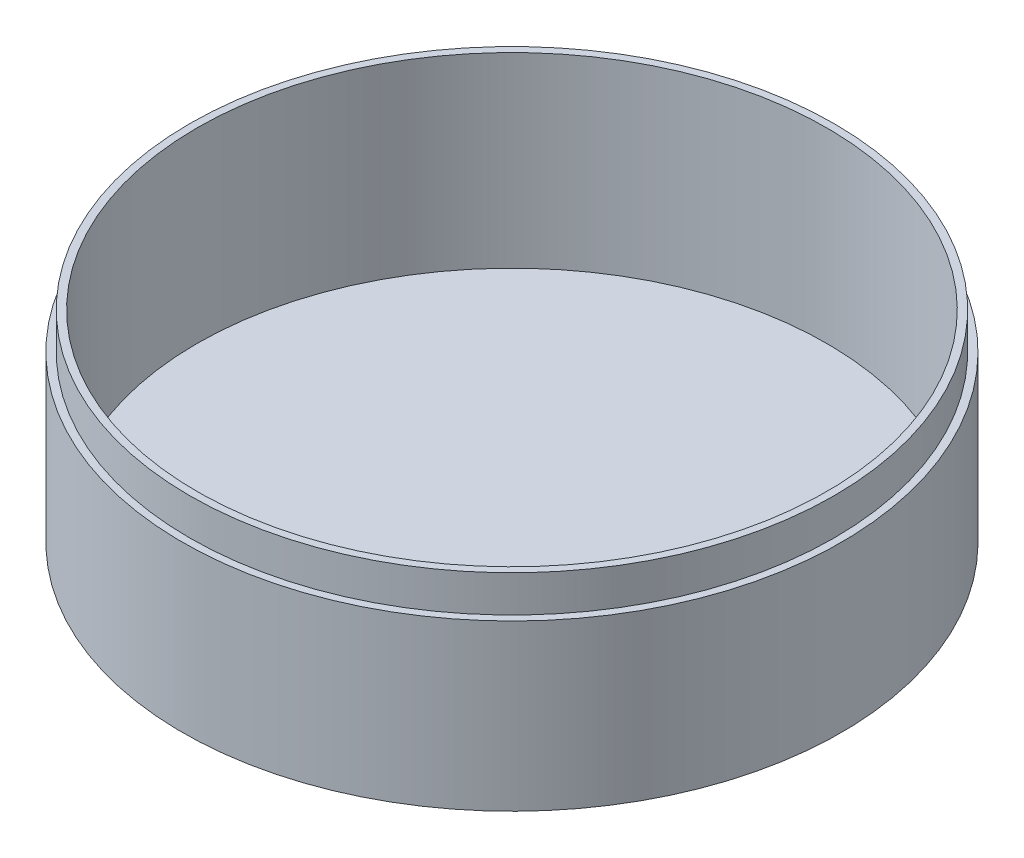
ISO-10303-21;
HEADER;
FILE_DESCRIPTION(('STEP AP214'),'2;1');
FILE_NAME('part.step','',(''),(''),'','','');
FILE_SCHEMA(('AUTOMOTIVE_DESIGN { 1 0 10303 214 1 1 1 1 }'));
ENDSEC;
DATA;
#1=APPLICATION_CONTEXT('core data for automotive mechanical design processes');
#2=APPLICATION_PROTOCOL_DEFINITION('international standard','automotive_design',2000,#1);
#3=PRODUCT_CONTEXT('',#1,'mechanical');
#4=PRODUCT('Part','Part','',(#3));
#5=PRODUCT_RELATED_PRODUCT_CATEGORY('part','',(#4));
#6=PRODUCT_DEFINITION_FORMATION('','',#4);
#7=PRODUCT_DEFINITION_CONTEXT('part definition',#1,'design');
#8=PRODUCT_DEFINITION('design','',#6,#7);
#9=PRODUCT_DEFINITION_SHAPE('','',#8);
#10=(LENGTH_UNIT() NAMED_UNIT(*) SI_UNIT(.MILLI.,.METRE.));
#11=(NAMED_UNIT(*) PLANE_ANGLE_UNIT() SI_UNIT($,.RADIAN.));
#12=(NAMED_UNIT(*) SI_UNIT($,.STERADIAN.) SOLID_ANGLE_UNIT());
#13=UNCERTAINTY_MEASURE_WITH_UNIT(LENGTH_MEASURE(1.E-05),#10,'distance_accuracy_value','');
#14=(GEOMETRIC_REPRESENTATION_CONTEXT(3) GLOBAL_UNCERTAINTY_ASSIGNED_CONTEXT((#13)) GLOBAL_UNIT_ASSIGNED_CONTEXT((#10,
#11,#12)) REPRESENTATION_CONTEXT('',''));
#15=CARTESIAN_POINT('',(0.,0.,0.));
#16=DIRECTION('',(0.,0.,1.));
#17=DIRECTION('',(1.,0.,0.));
#18=AXIS2_PLACEMENT_3D('',#15,#16,#17);
#19=CARTESIAN_POINT('',(0.,0.,0.));
#20=DIRECTION('',(0.,1.,0.));
#21=DIRECTION('',(-1.,0.,0.));
#22=AXIS2_PLACEMENT_3D('',#19,#20,#21);
#23=PLANE('',#22);
#24=CARTESIAN_POINT('',(0.,0.,0.));
#25=DIRECTION('',(0.,1.,0.));
#26=DIRECTION('',(-1.,0.,0.));
#27=AXIS2_PLACEMENT_3D('',#24,#25,#26);
#28=CIRCLE('',#27,114.3);
#29=CARTESIAN_POINT('',(-114.3,0.,0.));
#30=VERTEX_POINT('',#29);
#31=EDGE_CURVE('E10',#30,#30,#28,.T.);
#32=ORIENTED_EDGE('',*,*,#31,.F.);
#33=EDGE_LOOP('',(#32));
#34=FACE_BOUND('',#33,.T.);
#35=ADVANCED_FACE('F35',(#34),#23,.F.);
#36=CARTESIAN_POINT('',(0.,5.08,0.));
#37=DIRECTION('',(0.,1.,0.));
#38=DIRECTION('',(-1.,0.,0.));
#39=AXIS2_PLACEMENT_3D('',#36,#37,#38);
#40=CYLINDRICAL_SURFACE('',#39,114.3);
#41=CARTESIAN_POINT('',(0.,57.15,0.));
#42=DIRECTION('',(0.,1.,0.));
#43=DIRECTION('',(-1.,0.,0.));
#44=AXIS2_PLACEMENT_3D('',#41,#42,#43);
#45=CIRCLE('',#44,114.3);
#46=CARTESIAN_POINT('',(-114.3,57.15,0.));
#47=VERTEX_POINT('',#46);
#48=EDGE_CURVE('E41',#47,#47,#45,.T.);
#49=ORIENTED_EDGE('',*,*,#48,.F.);
#50=EDGE_LOOP('',(#49));
#51=FACE_BOUND('',#50,.T.);
#52=ORIENTED_EDGE('',*,*,#31,.T.);
#53=EDGE_LOOP('',(#52));
#54=FACE_BOUND('',#53,.T.);
#55=ADVANCED_FACE('F83',(#51,#54),#40,.T.);
#56=CARTESIAN_POINT('',(114.3,57.15,0.));
#57=DIRECTION('',(0.,-1.,0.));
#58=DIRECTION('',(1.,0.,0.));
#59=AXIS2_PLACEMENT_3D('',#56,#57,#58);
#60=PLANE('',#59);
#61=CARTESIAN_POINT('',(0.,57.15,0.));
#62=DIRECTION('',(0.,1.,0.));
#63=DIRECTION('',(-1.,0.,0.));
#64=AXIS2_PLACEMENT_3D('',#61,#62,#63);
#65=CIRCLE('',#64,111.76);
#66=CARTESIAN_POINT('',(-111.76,57.15,0.));
#67=VERTEX_POINT('',#66);
#68=EDGE_CURVE('E45',#67,#67,#65,.T.);
#69=ORIENTED_EDGE('',*,*,#68,.F.);
#70=EDGE_LOOP('',(#69));
#71=FACE_BOUND('',#70,.T.);
#72=ORIENTED_EDGE('',*,*,#48,.T.);
#73=EDGE_LOOP('',(#72));
#74=FACE_BOUND('',#73,.T.);
#75=ADVANCED_FACE('F78',(#71,#74),#60,.F.);
#76=CARTESIAN_POINT('',(0.,5.08,0.));
#77=DIRECTION('',(0.,1.,0.));
#78=DIRECTION('',(-1.,0.,0.));
#79=AXIS2_PLACEMENT_3D('',#76,#77,#78);
#80=CYLINDRICAL_SURFACE('',#79,111.76);
#81=CARTESIAN_POINT('',(0.,69.85,0.));
#82=DIRECTION('',(0.,1.,0.));
#83=DIRECTION('',(-1.,0.,0.));
#84=AXIS2_PLACEMENT_3D('',#81,#82,#83);
#85=CIRCLE('',#84,111.76);
#86=CARTESIAN_POINT('',(-111.76,69.85,0.));
#87=VERTEX_POINT('',#86);
#88=EDGE_CURVE('E49',#87,#87,#85,.T.);
#89=ORIENTED_EDGE('',*,*,#88,.F.);
#90=EDGE_LOOP('',(#89));
#91=FACE_BOUND('',#90,.T.);
#92=ORIENTED_EDGE('',*,*,#68,.T.);
#93=EDGE_LOOP('',(#92));
#94=FACE_BOUND('',#93,.T.);
#95=ADVANCED_FACE('F72',(#91,#94),#80,.T.);
#96=CARTESIAN_POINT('',(111.76,69.85,0.));
#97=DIRECTION('',(0.,-1.,0.));
#98=DIRECTION('',(1.,0.,0.));
#99=AXIS2_PLACEMENT_3D('',#96,#97,#98);
#100=PLANE('',#99);
#101=CARTESIAN_POINT('',(0.,69.85,0.));
#102=DIRECTION('',(0.,1.,0.));
#103=DIRECTION('',(-1.,0.,0.));
#104=AXIS2_PLACEMENT_3D('',#101,#102,#103);
#105=CIRCLE('',#104,109.22);
#106=CARTESIAN_POINT('',(-109.22,69.85,0.));
#107=VERTEX_POINT('',#106);
#108=EDGE_CURVE('E54',#107,#107,#105,.T.);
#109=ORIENTED_EDGE('',*,*,#108,.F.);
#110=EDGE_LOOP('',(#109));
#111=FACE_BOUND('',#110,.T.);
#112=ORIENTED_EDGE('',*,*,#88,.T.);
#113=EDGE_LOOP('',(#112));
#114=FACE_BOUND('',#113,.T.);
#115=ADVANCED_FACE('F66',(#111,#114),#100,.F.);
#116=CARTESIAN_POINT('',(0.,5.08,0.));
#117=DIRECTION('',(0.,1.,0.));
#118=DIRECTION('',(-1.,0.,0.));
#119=AXIS2_PLACEMENT_3D('',#116,#117,#118);
#120=CYLINDRICAL_SURFACE('',#119,109.22);
#121=CARTESIAN_POINT('',(0.,5.08000000000001,0.));
#122=DIRECTION('',(0.,1.,0.));
#123=DIRECTION('',(-1.,0.,0.));
#124=AXIS2_PLACEMENT_3D('',#121,#122,#123);
#125=CIRCLE('',#124,109.22);
#126=CARTESIAN_POINT('',(-109.22,5.08000000000002,0.));
#127=VERTEX_POINT('',#126);
#128=EDGE_CURVE('E57',#127,#127,#125,.T.);
#129=ORIENTED_EDGE('',*,*,#128,.F.);
#130=EDGE_LOOP('',(#129));
#131=FACE_BOUND('',#130,.T.);
#132=ORIENTED_EDGE('',*,*,#108,.T.);
#133=EDGE_LOOP('',(#132));
#134=FACE_BOUND('',#133,.T.);
#135=ADVANCED_FACE('F63',(#131,#134),#120,.F.);
#136=CARTESIAN_POINT('',(109.22,5.08,0.));
#137=DIRECTION('',(0.,-1.,0.));
#138=DIRECTION('',(1.,0.,0.));
#139=AXIS2_PLACEMENT_3D('',#136,#137,#138);
#140=PLANE('',#139);
#141=ORIENTED_EDGE('',*,*,#128,.T.);
#142=EDGE_LOOP('',(#141));
#143=FACE_BOUND('',#142,.T.);
#144=ADVANCED_FACE('F61',(#143),#140,.F.);
#145=CLOSED_SHELL('',(#35,#55,#75,#95,#115,#135,#144));
#146=MANIFOLD_SOLID_BREP('B2',#145);
#147=ADVANCED_BREP_SHAPE_REPRESENTATION('',(#18,#146),#14);
#148=SHAPE_DEFINITION_REPRESENTATION(#9,#147);
ENDSEC;
END-ISO-10303-21;
